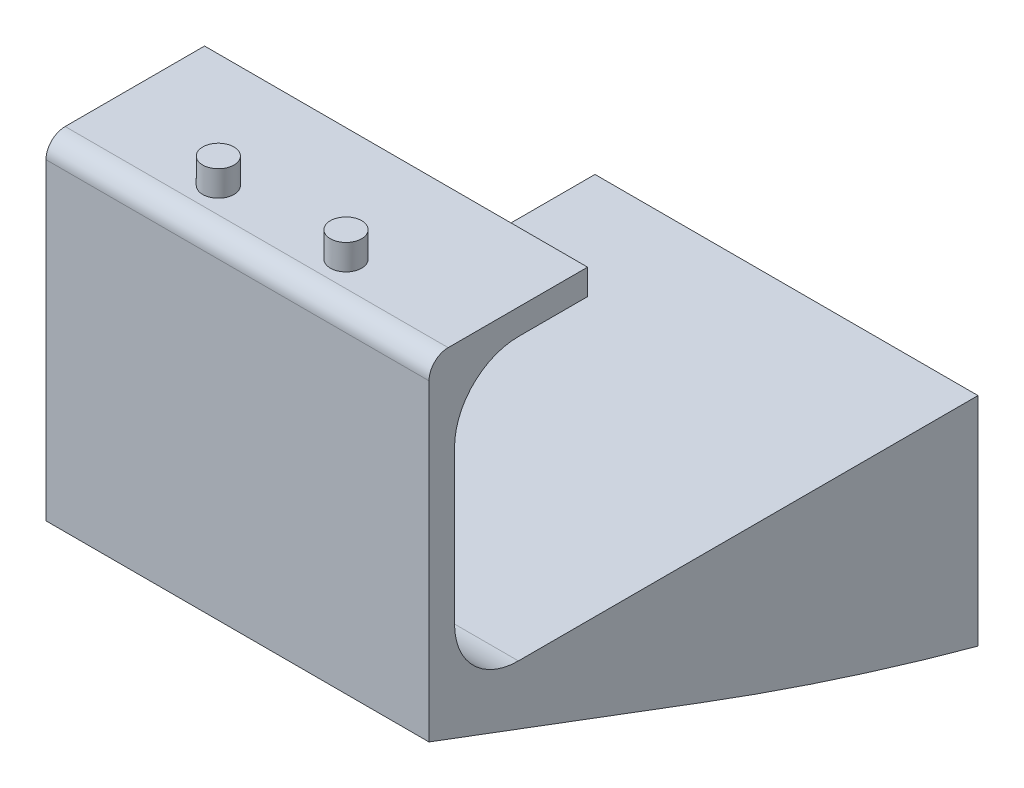
ISO-10303-21;
HEADER;
FILE_DESCRIPTION(('STEP AP214'),'2;1');
FILE_NAME('part.step','',(''),(''),'','','');
FILE_SCHEMA(('AUTOMOTIVE_DESIGN { 1 0 10303 214 1 1 1 1 }'));
ENDSEC;
DATA;
#1=APPLICATION_CONTEXT('core data for automotive mechanical design processes');
#2=APPLICATION_PROTOCOL_DEFINITION('international standard','automotive_design',2000,#1);
#3=PRODUCT_CONTEXT('',#1,'mechanical');
#4=PRODUCT('Part','Part','',(#3));
#5=PRODUCT_RELATED_PRODUCT_CATEGORY('part','',(#4));
#6=PRODUCT_DEFINITION_FORMATION('','',#4);
#7=PRODUCT_DEFINITION_CONTEXT('part definition',#1,'design');
#8=PRODUCT_DEFINITION('design','',#6,#7);
#9=PRODUCT_DEFINITION_SHAPE('','',#8);
#10=(LENGTH_UNIT() NAMED_UNIT(*) SI_UNIT(.MILLI.,.METRE.));
#11=(NAMED_UNIT(*) PLANE_ANGLE_UNIT() SI_UNIT($,.RADIAN.));
#12=(NAMED_UNIT(*) SI_UNIT($,.STERADIAN.) SOLID_ANGLE_UNIT());
#13=UNCERTAINTY_MEASURE_WITH_UNIT(LENGTH_MEASURE(1.E-05),#10,'distance_accuracy_value','');
#14=(GEOMETRIC_REPRESENTATION_CONTEXT(3) GLOBAL_UNCERTAINTY_ASSIGNED_CONTEXT((#13)) GLOBAL_UNIT_ASSIGNED_CONTEXT((#10,
#11,#12)) REPRESENTATION_CONTEXT('',''));
#15=CARTESIAN_POINT('',(0.,0.,0.));
#16=DIRECTION('',(0.,0.,1.));
#17=DIRECTION('',(1.,0.,0.));
#18=AXIS2_PLACEMENT_3D('',#15,#16,#17);
#19=CARTESIAN_POINT('',(-4.88498130835069E-12,-1.22124532708767E-12,43.));
#20=DIRECTION('',(0.,0.,-0.999999999999995));
#21=DIRECTION('',(-0.999999999999995,0.,0.));
#22=AXIS2_PLACEMENT_3D('',#19,#20,#21);
#23=PLANE('',#22);
#24=DIRECTION('',(0.,-1.,0.));
#25=VECTOR('',#24,1.);
#26=CARTESIAN_POINT('',(45.0000006705522,39.000000999999,42.9999999999998));
#27=LINE('',#26,#25);
#28=CARTESIAN_POINT('',(45.0000006705522,39.500000999999,42.9999999999998));
#29=VERTEX_POINT('',#28);
#30=CARTESIAN_POINT('',(44.9999999999999,14.9999999999988,42.9999999999976));
#31=VERTEX_POINT('',#30);
#32=EDGE_CURVE('E255',#29,#31,#27,.T.);
#33=ORIENTED_EDGE('',*,*,#32,.F.);
#34=DIRECTION('',(0.999999999999995,0.,0.));
#35=VECTOR('',#34,1.);
#36=CARTESIAN_POINT('',(0.,39.500000999999,43.));
#37=LINE('',#36,#35);
#38=CARTESIAN_POINT('',(14.9999999999999,39.500000999999,43.));
#39=VERTEX_POINT('',#38);
#40=EDGE_CURVE('E317',#29,#39,#37,.F.);
#41=ORIENTED_EDGE('',*,*,#40,.T.);
#42=DIRECTION('',(0.,1.,0.));
#43=VECTOR('',#42,1.);
#44=CARTESIAN_POINT('',(14.9999999999999,39.0000009999988,43.));
#45=LINE('',#44,#43);
#46=CARTESIAN_POINT('',(14.9999999999999,14.9999999999987,43.));
#47=VERTEX_POINT('',#46);
#48=EDGE_CURVE('E226',#47,#39,#45,.T.);
#49=ORIENTED_EDGE('',*,*,#48,.F.);
#50=DIRECTION('',(0.999999999999995,0.,0.));
#51=VECTOR('',#50,1.);
#52=CARTESIAN_POINT('',(14.9999999999999,14.9999999999987,43.));
#53=LINE('',#52,#51);
#54=CARTESIAN_POINT('',(18.,14.9999999999976,43.));
#55=VERTEX_POINT('',#54);
#56=EDGE_CURVE('E230',#47,#55,#53,.T.);
#57=ORIENTED_EDGE('',*,*,#56,.T.);
#58=DIRECTION('',(-0.999999999999995,0.,0.));
#59=VECTOR('',#58,1.);
#60=CARTESIAN_POINT('',(42.0000006705523,14.999999999999,42.9999999999975));
#61=LINE('',#60,#59);
#62=CARTESIAN_POINT('',(42.0000006705523,14.999999999999,42.9999999999975));
#63=VERTEX_POINT('',#62);
#64=EDGE_CURVE('E260',#63,#55,#61,.T.);
#65=ORIENTED_EDGE('',*,*,#64,.F.);
#66=DIRECTION('',(-0.999999999999995,0.,0.));
#67=VECTOR('',#66,1.);
#68=CARTESIAN_POINT('',(44.9999999999999,14.9999999999988,42.9999999999976));
#69=LINE('',#68,#67);
#70=EDGE_CURVE('E283',#31,#63,#69,.T.);
#71=ORIENTED_EDGE('',*,*,#70,.F.);
#72=EDGE_LOOP('',(#33,#41,#49,#57,#65,#71));
#73=FACE_BOUND('',#72,.T.);
#74=ADVANCED_FACE('F40',(#73),#23,.F.);
#75=CARTESIAN_POINT('',(42.0000003352761,236.859239142874,-64.5596687774861));
#76=DIRECTION('',(-0.999999999999995,0.,0.));
#77=DIRECTION('',(0.,0.,0.999999999999995));
#78=AXIS2_PLACEMENT_3D('',#75,#76,#77);
#79=CYLINDRICAL_SURFACE('',#78,245.5);
#80=DIRECTION('',(-0.999999999999995,0.,0.));
#81=VECTOR('',#80,1.);
#82=CARTESIAN_POINT('',(42.0000003352761,0.838178314233939,3.));
#83=LINE('',#82,#81);
#84=CARTESIAN_POINT('',(42.0000006705523,0.838178314233939,3.));
#85=VERTEX_POINT('',#84);
#86=CARTESIAN_POINT('',(18.,0.83817831423233,3.));
#87=VERTEX_POINT('',#86);
#88=EDGE_CURVE('E288',#85,#87,#83,.T.);
#89=ORIENTED_EDGE('',*,*,#88,.T.);
#90=CARTESIAN_POINT('',(18.,236.859239142871,-64.5596687774885));
#91=DIRECTION('',(-0.999999999999995,0.,0.));
#92=DIRECTION('',(0.,0.,-0.999999999999995));
#93=AXIS2_PLACEMENT_3D('',#90,#91,#92);
#94=CIRCLE('',#93,245.5);
#95=CARTESIAN_POINT('',(18.,6.99042604967193,21.6411361324593));
#96=VERTEX_POINT('',#95);
#97=EDGE_CURVE('E215',#87,#96,#94,.T.);
#98=ORIENTED_EDGE('',*,*,#97,.T.);
#99=DIRECTION('',(0.999999999999995,0.,0.));
#100=VECTOR('',#99,1.);
#101=CARTESIAN_POINT('',(14.9999999999999,6.99042604967193,21.6411361324593));
#102=LINE('',#101,#100);
#103=CARTESIAN_POINT('',(14.9999999999999,6.99042604967193,21.6411361324593));
#104=VERTEX_POINT('',#103);
#105=EDGE_CURVE('E239',#104,#96,#102,.T.);
#106=ORIENTED_EDGE('',*,*,#105,.F.);
#107=CARTESIAN_POINT('',(14.9999999999999,236.859239142874,-64.5596687774861));
#108=DIRECTION('',(-0.999999999999995,0.,0.));
#109=DIRECTION('',(0.,0.,-0.999999999999995));
#110=AXIS2_PLACEMENT_3D('',#107,#108,#109);
#111=CIRCLE('',#110,245.5);
#112=CARTESIAN_POINT('',(14.9999999999999,-1.0547118733939E-12,1.11022302462516E-13));
#113=VERTEX_POINT('',#112);
#114=EDGE_CURVE('E219',#113,#104,#111,.T.);
#115=ORIENTED_EDGE('',*,*,#114,.F.);
#116=DIRECTION('',(-0.999999999999995,0.,0.));
#117=VECTOR('',#116,1.);
#118=CARTESIAN_POINT('',(42.0000003352761,4.44089209850063E-13,0.));
#119=LINE('',#118,#117);
#120=CARTESIAN_POINT('',(44.9999999999999,2.22044604925031E-13,0.));
#121=VERTEX_POINT('',#120);
#122=EDGE_CURVE('E284',#121,#113,#119,.T.);
#123=ORIENTED_EDGE('',*,*,#122,.F.);
#124=CARTESIAN_POINT('',(44.9999999999999,236.859239142874,-64.5596687774861));
#125=DIRECTION('',(0.999999999999995,0.,0.));
#126=DIRECTION('',(0.,0.,0.999999999999995));
#127=AXIS2_PLACEMENT_3D('',#124,#125,#126);
#128=CIRCLE('',#127,245.5);
#129=CARTESIAN_POINT('',(44.9999999999999,6.9904260496732,21.6411361324614));
#130=VERTEX_POINT('',#129);
#131=EDGE_CURVE('E267',#130,#121,#128,.T.);
#132=ORIENTED_EDGE('',*,*,#131,.F.);
#133=DIRECTION('',(-0.999999999999995,0.,0.));
#134=VECTOR('',#133,1.);
#135=CARTESIAN_POINT('',(44.9999999999999,6.9904260496732,21.6411361324614));
#136=LINE('',#135,#134);
#137=CARTESIAN_POINT('',(42.0000006705523,6.99042604967359,21.6411361324615));
#138=VERTEX_POINT('',#137);
#139=EDGE_CURVE('E276',#130,#138,#136,.T.);
#140=ORIENTED_EDGE('',*,*,#139,.T.);
#141=CARTESIAN_POINT('',(42.0000003352761,236.859239142874,-64.5596687774861));
#142=DIRECTION('',(0.999999999999995,0.,0.));
#143=DIRECTION('',(0.,0.,0.999999999999995));
#144=AXIS2_PLACEMENT_3D('',#141,#142,#143);
#145=CIRCLE('',#144,245.5);
#146=EDGE_CURVE('E268',#138,#85,#145,.T.);
#147=ORIENTED_EDGE('',*,*,#146,.T.);
#148=EDGE_LOOP('',(#89,#98,#106,#115,#123,#132,#140,#147));
#149=FACE_BOUND('',#148,.T.);
#150=ADVANCED_FACE('F368',(#149),#79,.T.);
#151=CARTESIAN_POINT('',(42.0000003352761,0.838178314235161,8.88178419700125E-13));
#152=DIRECTION('',(0.,0.,-0.999999999999995));
#153=DIRECTION('',(0.,1.,0.));
#154=AXIS2_PLACEMENT_3D('',#151,#152,#153);
#155=PLANE('',#154);
#156=CARTESIAN_POINT('',(36.0000000447005,9.99999999999879,0.));
#157=DIRECTION('',(0.,0.,0.999999999999995));
#158=DIRECTION('',(0.999999999999995,0.,0.));
#159=AXIS2_PLACEMENT_3D('',#156,#157,#158);
#160=CIRCLE('',#159,2.49999999999999);
#161=CARTESIAN_POINT('',(38.5000000447036,9.99999999999879,0.));
#162=VERTEX_POINT('',#161);
#163=EDGE_CURVE('E423',#162,#162,#160,.T.);
#164=ORIENTED_EDGE('',*,*,#163,.T.);
#165=EDGE_LOOP('',(#164));
#166=FACE_BOUND('',#165,.T.);
#167=CARTESIAN_POINT('',(23.9999999552933,10.,0.));
#168=DIRECTION('',(0.,0.,0.999999999999995));
#169=DIRECTION('',(0.999999999999995,0.,0.));
#170=AXIS2_PLACEMENT_3D('',#167,#168,#169);
#171=CIRCLE('',#170,2.49999999999999);
#172=CARTESIAN_POINT('',(26.4999999552964,9.99999999999757,0.));
#173=VERTEX_POINT('',#172);
#174=EDGE_CURVE('E192',#173,#173,#171,.T.);
#175=ORIENTED_EDGE('',*,*,#174,.T.);
#176=EDGE_LOOP('',(#175));
#177=FACE_BOUND('',#176,.T.);
#178=DIRECTION('',(-0.999999999999995,0.,0.));
#179=VECTOR('',#178,1.);
#180=CARTESIAN_POINT('',(45.0000249999969,17.,0.));
#181=LINE('',#180,#179);
#182=CARTESIAN_POINT('',(44.999999999997,17.,0.));
#183=VERTEX_POINT('',#182);
#184=CARTESIAN_POINT('',(14.999999999997,16.9999999999988,-1.55431223447522E-12));
#185=VERTEX_POINT('',#184);
#186=EDGE_CURVE('E205',#183,#185,#181,.T.);
#187=ORIENTED_EDGE('',*,*,#186,.F.);
#188=DIRECTION('',(0.,1.,0.));
#189=VECTOR('',#188,1.);
#190=CARTESIAN_POINT('',(44.9999999999968,15.,-2.44249065417534E-12));
#191=LINE('',#190,#189);
#192=EDGE_CURVE('E272',#121,#183,#191,.T.);
#193=ORIENTED_EDGE('',*,*,#192,.F.);
#194=ORIENTED_EDGE('',*,*,#122,.T.);
#195=DIRECTION('',(0.,-1.,0.));
#196=VECTOR('',#195,1.);
#197=CARTESIAN_POINT('',(14.9999999999999,-9.99200722162641E-13,0.));
#198=LINE('',#197,#196);
#199=EDGE_CURVE('E216',#185,#113,#198,.T.);
#200=ORIENTED_EDGE('',*,*,#199,.F.);
#201=EDGE_LOOP('',(#187,#193,#194,#200));
#202=FACE_BOUND('',#201,.T.);
#203=ADVANCED_FACE('F374',(#166,#177,#202),#155,.T.);
#204=CARTESIAN_POINT('',(44.9999999999999,6.99042604967326,21.6411361324615));
#205=DIRECTION('',(0.,0.936329177569047,-0.351123441588383));
#206=DIRECTION('',(0.,0.351123441588386,0.936329177569042));
#207=AXIS2_PLACEMENT_3D('',#204,#205,#206);
#208=PLANE('',#207);
#209=DIRECTION('',(0.,-0.351123441588386,-0.936329177569042));
#210=VECTOR('',#209,1.);
#211=CARTESIAN_POINT('',(42.0000003352761,6.99042604967326,21.6411361324615));
#212=LINE('',#211,#210);
#213=EDGE_CURVE('E263',#63,#138,#212,.T.);
#214=ORIENTED_EDGE('',*,*,#213,.T.);
#215=ORIENTED_EDGE('',*,*,#139,.F.);
#216=DIRECTION('',(0.,-0.351123441588386,-0.936329177569042));
#217=VECTOR('',#216,1.);
#218=CARTESIAN_POINT('',(44.9999999999999,6.99042604967326,21.6411361324615));
#219=LINE('',#218,#217);
#220=EDGE_CURVE('E264',#31,#130,#219,.T.);
#221=ORIENTED_EDGE('',*,*,#220,.F.);
#222=ORIENTED_EDGE('',*,*,#70,.T.);
#223=EDGE_LOOP('',(#214,#215,#221,#222));
#224=FACE_BOUND('',#223,.T.);
#225=ADVANCED_FACE('F385',(#224),#208,.F.);
#226=CARTESIAN_POINT('',(44.9999999999999,236.859239142874,-64.5596687774861));
#227=DIRECTION('',(-0.999999999999995,0.,0.));
#228=DIRECTION('',(0.,0.,0.999999999999995));
#229=AXIS2_PLACEMENT_3D('',#226,#227,#228);
#230=PLANE('',#229);
#231=DIRECTION('',(0.,0.,-0.999999999999995));
#232=VECTOR('',#231,1.);
#233=CARTESIAN_POINT('',(45.0000006705491,41.000000999999,30.579892407551));
#234=LINE('',#233,#232);
#235=CARTESIAN_POINT('',(45.0000006705522,41.0000010000002,41.5));
#236=VERTEX_POINT('',#235);
#237=CARTESIAN_POINT('',(45.0000006705491,41.000000999999,30.579892407551));
#238=VERTEX_POINT('',#237);
#239=EDGE_CURVE('E156',#236,#238,#234,.T.);
#240=ORIENTED_EDGE('',*,*,#239,.F.);
#241=CARTESIAN_POINT('',(44.9999999999999,39.5000010000002,41.5));
#242=DIRECTION('',(-0.999999999999995,0.,0.));
#243=DIRECTION('',(0.,0.,0.999999999999995));
#244=AXIS2_PLACEMENT_3D('',#241,#242,#243);
#245=CIRCLE('',#244,1.5);
#246=EDGE_CURVE('E314',#236,#29,#245,.F.);
#247=ORIENTED_EDGE('',*,*,#246,.T.);
#248=ORIENTED_EDGE('',*,*,#32,.T.);
#249=ORIENTED_EDGE('',*,*,#220,.T.);
#250=ORIENTED_EDGE('',*,*,#131,.T.);
#251=ORIENTED_EDGE('',*,*,#192,.T.);
#252=DIRECTION('',(0.,0.,0.999999999999995));
#253=VECTOR('',#252,1.);
#254=CARTESIAN_POINT('',(44.9999999999999,17.,-64.5596687774885));
#255=LINE('',#254,#253);
#256=CARTESIAN_POINT('',(44.9999999999982,17.,35.9999999999999));
#257=VERTEX_POINT('',#256);
#258=EDGE_CURVE('E208',#183,#257,#255,.T.);
#259=ORIENTED_EDGE('',*,*,#258,.T.);
#260=CARTESIAN_POINT('',(44.9999999999999,22.,35.9999999999976));
#261=DIRECTION('',(-0.999999999999995,0.,0.));
#262=DIRECTION('',(0.,0.,0.999999999999995));
#263=AXIS2_PLACEMENT_3D('',#260,#261,#262);
#264=CIRCLE('',#263,5.);
#265=CARTESIAN_POINT('',(44.9999999999982,22.,40.9999999999976));
#266=VERTEX_POINT('',#265);
#267=EDGE_CURVE('E339',#257,#266,#264,.T.);
#268=ORIENTED_EDGE('',*,*,#267,.T.);
#269=DIRECTION('',(0.,1.,0.));
#270=VECTOR('',#269,1.);
#271=CARTESIAN_POINT('',(44.999999999997,236.859239142874,41.));
#272=LINE('',#271,#270);
#273=CARTESIAN_POINT('',(44.9999999999999,34.0000010000002,40.9999999999999));
#274=VERTEX_POINT('',#273);
#275=EDGE_CURVE('E212',#266,#274,#272,.T.);
#276=ORIENTED_EDGE('',*,*,#275,.T.);
#277=CARTESIAN_POINT('',(44.9999999999999,34.0000010000002,35.9999999999999));
#278=DIRECTION('',(-0.999999999999995,0.,0.));
#279=DIRECTION('',(0.,0.,0.999999999999995));
#280=AXIS2_PLACEMENT_3D('',#277,#278,#279);
#281=CIRCLE('',#280,5.);
#282=CARTESIAN_POINT('',(45.0000006705522,39.0000010000002,35.9999999999999));
#283=VERTEX_POINT('',#282);
#284=EDGE_CURVE('E64',#274,#283,#281,.T.);
#285=ORIENTED_EDGE('',*,*,#284,.T.);
#286=DIRECTION('',(0.,0.,-0.999999999999995));
#287=VECTOR('',#286,1.);
#288=CARTESIAN_POINT('',(45.0000006705522,39.000000999999,30.579892407551));
#289=LINE('',#288,#287);
#290=CARTESIAN_POINT('',(45.0000006705522,39.000000999999,30.579892407551));
#291=VERTEX_POINT('',#290);
#292=EDGE_CURVE('E171',#283,#291,#289,.T.);
#293=ORIENTED_EDGE('',*,*,#292,.T.);
#294=DIRECTION('',(0.,-1.,0.));
#295=VECTOR('',#294,1.);
#296=CARTESIAN_POINT('',(45.0000006705491,41.000000999999,30.579892407551));
#297=LINE('',#296,#295);
#298=EDGE_CURVE('E169',#238,#291,#297,.T.);
#299=ORIENTED_EDGE('',*,*,#298,.F.);
#300=EDGE_LOOP('',(#240,#247,#248,#249,#250,#251,#259,#268,#276,#285,#293,#299));
#301=FACE_BOUND('',#300,.T.);
#302=ADVANCED_FACE('F170',(#301),#230,.F.);
#303=CARTESIAN_POINT('',(42.0000006705523,6.99042604967359,21.6411361324627));
#304=DIRECTION('',(0.999999999999995,0.,0.));
#305=DIRECTION('',(0.,0.,-0.999999999999995));
#306=AXIS2_PLACEMENT_3D('',#303,#304,#305);
#307=PLANE('',#306);
#308=ORIENTED_EDGE('',*,*,#146,.F.);
#309=ORIENTED_EDGE('',*,*,#213,.F.);
#310=DIRECTION('',(0.,0.,0.999999999999995));
#311=VECTOR('',#310,1.);
#312=CARTESIAN_POINT('',(42.0000006705492,14.9999999999976,2.99999999999756));
#313=LINE('',#312,#311);
#314=CARTESIAN_POINT('',(42.0000006705492,14.9999999999976,2.99999999999756));
#315=VERTEX_POINT('',#314);
#316=EDGE_CURVE('E251',#315,#63,#313,.T.);
#317=ORIENTED_EDGE('',*,*,#316,.F.);
#318=DIRECTION('',(0.,-1.,0.));
#319=VECTOR('',#318,1.);
#320=CARTESIAN_POINT('',(42.0000006705523,6.99042604967115,2.99999999999989));
#321=LINE('',#320,#319);
#322=EDGE_CURVE('E252',#315,#85,#321,.T.);
#323=ORIENTED_EDGE('',*,*,#322,.T.);
#324=EDGE_LOOP('',(#308,#309,#317,#323));
#325=FACE_BOUND('',#324,.T.);
#326=ADVANCED_FACE('F384',(#325),#307,.F.);
#327=CARTESIAN_POINT('',(18.,6.99042604967104,2.99999999999989));
#328=DIRECTION('',(0.,0.,-0.999999999999995));
#329=DIRECTION('',(0.,1.,0.));
#330=AXIS2_PLACEMENT_3D('',#327,#328,#329);
#331=PLANE('',#330);
#332=CARTESIAN_POINT('',(36.0000000447036,9.99999999999879,3.));
#333=DIRECTION('',(0.,0.,0.999999999999995));
#334=DIRECTION('',(0.999999999999995,0.,0.));
#335=AXIS2_PLACEMENT_3D('',#332,#333,#334);
#336=CIRCLE('',#335,2.49999999999999);
#337=CARTESIAN_POINT('',(38.5000000447036,9.99999999999879,3.));
#338=VERTEX_POINT('',#337);
#339=EDGE_CURVE('E427',#338,#338,#336,.T.);
#340=ORIENTED_EDGE('',*,*,#339,.F.);
#341=EDGE_LOOP('',(#340));
#342=FACE_BOUND('',#341,.T.);
#343=CARTESIAN_POINT('',(23.9999999552964,9.99999999999757,3.));
#344=DIRECTION('',(0.,0.,0.999999999999995));
#345=DIRECTION('',(0.999999999999995,0.,0.));
#346=AXIS2_PLACEMENT_3D('',#343,#344,#345);
#347=CIRCLE('',#346,2.49999999999999);
#348=CARTESIAN_POINT('',(26.4999999552964,9.99999999999757,3.));
#349=VERTEX_POINT('',#348);
#350=EDGE_CURVE('E419',#349,#349,#347,.T.);
#351=ORIENTED_EDGE('',*,*,#350,.F.);
#352=EDGE_LOOP('',(#351));
#353=FACE_BOUND('',#352,.T.);
#354=ORIENTED_EDGE('',*,*,#88,.F.);
#355=ORIENTED_EDGE('',*,*,#322,.F.);
#356=DIRECTION('',(0.999999999999995,0.,0.));
#357=VECTOR('',#356,1.);
#358=CARTESIAN_POINT('',(17.9999999999969,14.9999999999976,2.99999999999745));
#359=LINE('',#358,#357);
#360=CARTESIAN_POINT('',(17.9999999999969,14.9999999999976,2.99999999999745));
#361=VERTEX_POINT('',#360);
#362=EDGE_CURVE('E247',#361,#315,#359,.T.);
#363=ORIENTED_EDGE('',*,*,#362,.F.);
#364=DIRECTION('',(0.,-1.,0.));
#365=VECTOR('',#364,1.);
#366=CARTESIAN_POINT('',(18.,6.99042604967104,2.99999999999989));
#367=LINE('',#366,#365);
#368=EDGE_CURVE('E256',#361,#87,#367,.T.);
#369=ORIENTED_EDGE('',*,*,#368,.T.);
#370=EDGE_LOOP('',(#354,#355,#363,#369));
#371=FACE_BOUND('',#370,.T.);
#372=ADVANCED_FACE('F380',(#342,#353,#371),#331,.F.);
#373=CARTESIAN_POINT('',(-3.10862446895044E-12,15.,-2.55351295663786E-12));
#374=DIRECTION('',(0.,-1.,0.));
#375=DIRECTION('',(0.,0.,-0.999999999999995));
#376=AXIS2_PLACEMENT_3D('',#373,#374,#375);
#377=PLANE('',#376);
#378=DIRECTION('',(0.,0.,-0.999999999999995));
#379=VECTOR('',#378,1.);
#380=CARTESIAN_POINT('',(18.,14.9999999999978,43.));
#381=LINE('',#380,#379);
#382=EDGE_CURVE('E243',#55,#361,#381,.T.);
#383=ORIENTED_EDGE('',*,*,#382,.T.);
#384=ORIENTED_EDGE('',*,*,#362,.T.);
#385=ORIENTED_EDGE('',*,*,#316,.T.);
#386=ORIENTED_EDGE('',*,*,#64,.T.);
#387=EDGE_LOOP('',(#383,#384,#385,#386));
#388=FACE_BOUND('',#387,.T.);
#389=ADVANCED_FACE('F471',(#388),#377,.T.);
#390=CARTESIAN_POINT('',(18.,236.859239142871,-64.5596687774885));
#391=DIRECTION('',(0.999999999999995,0.,0.));
#392=DIRECTION('',(0.,0.,-0.999999999999995));
#393=AXIS2_PLACEMENT_3D('',#390,#391,#392);
#394=PLANE('',#393);
#395=ORIENTED_EDGE('',*,*,#368,.F.);
#396=ORIENTED_EDGE('',*,*,#382,.F.);
#397=DIRECTION('',(0.,0.351123441588391,0.93632917756904));
#398=VECTOR('',#397,1.);
#399=CARTESIAN_POINT('',(18.,14.9999999999976,43.));
#400=LINE('',#399,#398);
#401=EDGE_CURVE('E220',#96,#55,#400,.T.);
#402=ORIENTED_EDGE('',*,*,#401,.F.);
#403=ORIENTED_EDGE('',*,*,#97,.F.);
#404=EDGE_LOOP('',(#395,#396,#402,#403));
#405=FACE_BOUND('',#404,.T.);
#406=ADVANCED_FACE('F488',(#405),#394,.T.);
#407=CARTESIAN_POINT('',(14.9999999999999,14.9999999999987,43.));
#408=DIRECTION('',(0.,0.936329177569045,-0.351123441588388));
#409=DIRECTION('',(0.,0.351123441588391,0.93632917756904));
#410=AXIS2_PLACEMENT_3D('',#407,#408,#409);
#411=PLANE('',#410);
#412=ORIENTED_EDGE('',*,*,#401,.T.);
#413=ORIENTED_EDGE('',*,*,#56,.F.);
#414=DIRECTION('',(0.,0.351123441588391,0.93632917756904));
#415=VECTOR('',#414,1.);
#416=CARTESIAN_POINT('',(14.9999999999999,14.9999999999987,43.));
#417=LINE('',#416,#415);
#418=EDGE_CURVE('E223',#104,#47,#417,.T.);
#419=ORIENTED_EDGE('',*,*,#418,.F.);
#420=ORIENTED_EDGE('',*,*,#105,.T.);
#421=EDGE_LOOP('',(#412,#413,#419,#420));
#422=FACE_BOUND('',#421,.T.);
#423=ADVANCED_FACE('F490',(#422),#411,.F.);
#424=CARTESIAN_POINT('',(14.9999999999999,236.859239142874,-64.5596687774861));
#425=DIRECTION('',(0.999999999999995,0.,0.));
#426=DIRECTION('',(0.,0.,-0.999999999999995));
#427=AXIS2_PLACEMENT_3D('',#424,#425,#426);
#428=PLANE('',#427);
#429=ORIENTED_EDGE('',*,*,#48,.T.);
#430=CARTESIAN_POINT('',(14.9999999999999,39.5000010000001,41.5));
#431=DIRECTION('',(0.999999999999995,0.,0.));
#432=DIRECTION('',(0.,0.,-0.999999999999995));
#433=AXIS2_PLACEMENT_3D('',#430,#431,#432);
#434=CIRCLE('',#433,1.5);
#435=CARTESIAN_POINT('',(14.9999999999999,41.0000010000001,41.5));
#436=VERTEX_POINT('',#435);
#437=EDGE_CURVE('E320',#39,#436,#434,.F.);
#438=ORIENTED_EDGE('',*,*,#437,.T.);
#439=DIRECTION('',(0.,0.,0.999999999999995));
#440=VECTOR('',#439,1.);
#441=CARTESIAN_POINT('',(14.9999999999999,41.000000999999,43.));
#442=LINE('',#441,#440);
#443=CARTESIAN_POINT('',(14.999999999997,41.0000009999989,30.579892407551));
#444=VERTEX_POINT('',#443);
#445=EDGE_CURVE('E166',#444,#436,#442,.T.);
#446=ORIENTED_EDGE('',*,*,#445,.F.);
#447=DIRECTION('',(0.,-1.,0.));
#448=VECTOR('',#447,1.);
#449=CARTESIAN_POINT('',(14.999999999997,41.0000009999989,30.579892407551));
#450=LINE('',#449,#448);
#451=CARTESIAN_POINT('',(15.0000000000001,39.0000009999989,30.579892407551));
#452=VERTEX_POINT('',#451);
#453=EDGE_CURVE('E176',#444,#452,#450,.T.);
#454=ORIENTED_EDGE('',*,*,#453,.T.);
#455=DIRECTION('',(0.,0.,0.999999999999995));
#456=VECTOR('',#455,1.);
#457=CARTESIAN_POINT('',(14.9999999999999,39.000000999999,43.));
#458=LINE('',#457,#456);
#459=CARTESIAN_POINT('',(14.9999999999999,39.000000999999,35.9999999999999));
#460=VERTEX_POINT('',#459);
#461=EDGE_CURVE('E188',#452,#460,#458,.T.);
#462=ORIENTED_EDGE('',*,*,#461,.T.);
#463=CARTESIAN_POINT('',(14.9999999999999,34.0000009999989,35.9999999999999));
#464=DIRECTION('',(0.999999999999995,0.,0.));
#465=DIRECTION('',(0.,0.,-0.999999999999995));
#466=AXIS2_PLACEMENT_3D('',#463,#464,#465);
#467=CIRCLE('',#466,5.);
#468=CARTESIAN_POINT('',(14.9999999999999,34.0000009999989,40.9999999999998));
#469=VERTEX_POINT('',#468);
#470=EDGE_CURVE('E56',#460,#469,#467,.T.);
#471=ORIENTED_EDGE('',*,*,#470,.T.);
#472=DIRECTION('',(0.,1.,0.));
#473=VECTOR('',#472,1.);
#474=CARTESIAN_POINT('',(14.9999999999981,16.9999999999988,40.9999999999985));
#475=LINE('',#474,#473);
#476=CARTESIAN_POINT('',(14.9999999999981,21.9999999999988,40.9999999999968));
#477=VERTEX_POINT('',#476);
#478=EDGE_CURVE('E201',#477,#469,#475,.T.);
#479=ORIENTED_EDGE('',*,*,#478,.F.);
#480=CARTESIAN_POINT('',(14.9999999999999,21.9999999999988,35.9999999999967));
#481=DIRECTION('',(0.999999999999995,0.,0.));
#482=DIRECTION('',(0.,0.,-0.999999999999995));
#483=AXIS2_PLACEMENT_3D('',#480,#481,#482);
#484=CIRCLE('',#483,5.);
#485=CARTESIAN_POINT('',(14.9999999999981,16.9999999999988,35.9999999999984));
#486=VERTEX_POINT('',#485);
#487=EDGE_CURVE('E336',#477,#486,#484,.T.);
#488=ORIENTED_EDGE('',*,*,#487,.T.);
#489=DIRECTION('',(0.,0.,0.999999999999995));
#490=VECTOR('',#489,1.);
#491=CARTESIAN_POINT('',(14.999999999997,16.9999999999988,-1.55431223447522E-12));
#492=LINE('',#491,#490);
#493=EDGE_CURVE('E175',#185,#486,#492,.T.);
#494=ORIENTED_EDGE('',*,*,#493,.F.);
#495=ORIENTED_EDGE('',*,*,#199,.T.);
#496=ORIENTED_EDGE('',*,*,#114,.T.);
#497=ORIENTED_EDGE('',*,*,#418,.T.);
#498=EDGE_LOOP('',(#429,#438,#446,#454,#462,#471,#479,#488,#494,#495,#496,#497));
#499=FACE_BOUND('',#498,.T.);
#500=ADVANCED_FACE('F411',(#499),#428,.F.);
#501=CARTESIAN_POINT('',(45.0000249999982,17.,40.9999999999999));
#502=DIRECTION('',(0.,0.,0.999999999999995));
#503=DIRECTION('',(0.999999999999995,0.,0.));
#504=AXIS2_PLACEMENT_3D('',#501,#502,#503);
#505=PLANE('',#504);
#506=ORIENTED_EDGE('',*,*,#275,.F.);
#507=DIRECTION('',(-0.999999999999995,0.,0.));
#508=VECTOR('',#507,1.);
#509=CARTESIAN_POINT('',(14.9999999999981,21.9999999999988,40.9999999999968));
#510=LINE('',#509,#508);
#511=EDGE_CURVE('E326',#266,#477,#510,.T.);
#512=ORIENTED_EDGE('',*,*,#511,.T.);
#513=ORIENTED_EDGE('',*,*,#478,.T.);
#514=DIRECTION('',(-0.999999999999995,0.,0.));
#515=VECTOR('',#514,1.);
#516=CARTESIAN_POINT('',(45.000025,34.0000010000002,40.9999999999999));
#517=LINE('',#516,#515);
#518=EDGE_CURVE('E323',#469,#274,#517,.F.);
#519=ORIENTED_EDGE('',*,*,#518,.T.);
#520=EDGE_LOOP('',(#506,#512,#513,#519));
#521=FACE_BOUND('',#520,.T.);
#522=ADVANCED_FACE('F407',(#521),#505,.F.);
#523=CARTESIAN_POINT('',(45.0000249999969,17.,0.));
#524=DIRECTION('',(0.,-1.,0.));
#525=DIRECTION('',(0.,0.,-0.999999999999995));
#526=AXIS2_PLACEMENT_3D('',#523,#524,#525);
#527=PLANE('',#526);
#528=ORIENTED_EDGE('',*,*,#493,.T.);
#529=DIRECTION('',(-0.999999999999995,0.,0.));
#530=VECTOR('',#529,1.);
#531=CARTESIAN_POINT('',(44.9999999999982,17.,35.9999999999999));
#532=LINE('',#531,#530);
#533=EDGE_CURVE('E330',#486,#257,#532,.F.);
#534=ORIENTED_EDGE('',*,*,#533,.T.);
#535=ORIENTED_EDGE('',*,*,#258,.F.);
#536=ORIENTED_EDGE('',*,*,#186,.T.);
#537=EDGE_LOOP('',(#528,#534,#535,#536));
#538=FACE_BOUND('',#537,.T.);
#539=ADVANCED_FACE('F363',(#538),#527,.F.);
#540=CARTESIAN_POINT('',(14.999999999997,41.0000009999989,30.579892407551));
#541=DIRECTION('',(0.,0.,0.999999999999995));
#542=DIRECTION('',(0.,-1.,0.));
#543=AXIS2_PLACEMENT_3D('',#540,#541,#542);
#544=PLANE('',#543);
#545=DIRECTION('',(-0.999999999999995,0.,0.));
#546=VECTOR('',#545,1.);
#547=CARTESIAN_POINT('',(15.0000000000001,39.0000009999989,30.579892407551));
#548=LINE('',#547,#546);
#549=EDGE_CURVE('E195',#291,#452,#548,.T.);
#550=ORIENTED_EDGE('',*,*,#549,.T.);
#551=ORIENTED_EDGE('',*,*,#453,.F.);
#552=DIRECTION('',(-0.999999999999995,0.,0.));
#553=VECTOR('',#552,1.);
#554=CARTESIAN_POINT('',(14.999999999997,41.0000009999989,30.579892407551));
#555=LINE('',#554,#553);
#556=EDGE_CURVE('E161',#238,#444,#555,.T.);
#557=ORIENTED_EDGE('',*,*,#556,.F.);
#558=ORIENTED_EDGE('',*,*,#298,.T.);
#559=EDGE_LOOP('',(#550,#551,#557,#558));
#560=FACE_BOUND('',#559,.T.);
#561=ADVANCED_FACE('F178',(#560),#544,.F.);
#562=CARTESIAN_POINT('',(0.,41.000001,6.66133814775094E-13));
#563=DIRECTION('',(0.,-1.,0.));
#564=DIRECTION('',(0.,0.,-0.999999999999995));
#565=AXIS2_PLACEMENT_3D('',#562,#563,#564);
#566=PLANE('',#565);
#567=CARTESIAN_POINT('',(34.9999999999999,41.0000009999979,39.5));
#568=DIRECTION('',(0.,-1.,0.));
#569=DIRECTION('',(0.,0.,-0.999999999999995));
#570=AXIS2_PLACEMENT_3D('',#567,#568,#569);
#571=CIRCLE('',#570,1.225);
#572=CARTESIAN_POINT('',(34.9999999999999,41.0000009999979,38.275));
#573=VERTEX_POINT('',#572);
#574=EDGE_CURVE('E11',#573,#573,#571,.F.);
#575=ORIENTED_EDGE('',*,*,#574,.F.);
#576=EDGE_LOOP('',(#575));
#577=FACE_BOUND('',#576,.T.);
#578=CARTESIAN_POINT('',(24.9999999999999,41.000000999999,39.5));
#579=DIRECTION('',(0.,-1.,0.));
#580=DIRECTION('',(0.,0.,-0.999999999999995));
#581=AXIS2_PLACEMENT_3D('',#578,#579,#580);
#582=CIRCLE('',#581,1.22499999999999);
#583=CARTESIAN_POINT('',(24.9999999999999,41.0000009999989,38.275));
#584=VERTEX_POINT('',#583);
#585=EDGE_CURVE('E49',#584,#584,#582,.F.);
#586=ORIENTED_EDGE('',*,*,#585,.F.);
#587=EDGE_LOOP('',(#586));
#588=FACE_BOUND('',#587,.T.);
#589=ORIENTED_EDGE('',*,*,#445,.T.);
#590=DIRECTION('',(0.999999999999995,0.,0.));
#591=VECTOR('',#590,1.);
#592=CARTESIAN_POINT('',(0.,41.0000010000002,41.5));
#593=LINE('',#592,#591);
#594=EDGE_CURVE('E164',#436,#236,#593,.T.);
#595=ORIENTED_EDGE('',*,*,#594,.T.);
#596=ORIENTED_EDGE('',*,*,#239,.T.);
#597=ORIENTED_EDGE('',*,*,#556,.T.);
#598=EDGE_LOOP('',(#589,#595,#596,#597));
#599=FACE_BOUND('',#598,.T.);
#600=ADVANCED_FACE('F159',(#577,#588,#599),#566,.F.);
#601=CARTESIAN_POINT('',(-4.88498130835069E-12,39.000001,6.66133814775094E-13));
#602=DIRECTION('',(0.,-1.,0.));
#603=DIRECTION('',(0.,0.,-0.999999999999995));
#604=AXIS2_PLACEMENT_3D('',#601,#602,#603);
#605=PLANE('',#604);
#606=ORIENTED_EDGE('',*,*,#292,.F.);
#607=DIRECTION('',(-0.999999999999995,0.,0.));
#608=VECTOR('',#607,1.);
#609=CARTESIAN_POINT('',(0.,39.0000010000002,35.9999999999999));
#610=LINE('',#609,#608);
#611=EDGE_CURVE('E333',#283,#460,#610,.T.);
#612=ORIENTED_EDGE('',*,*,#611,.T.);
#613=ORIENTED_EDGE('',*,*,#461,.F.);
#614=ORIENTED_EDGE('',*,*,#549,.F.);
#615=EDGE_LOOP('',(#606,#612,#613,#614));
#616=FACE_BOUND('',#615,.T.);
#617=ADVANCED_FACE('F353',(#616),#605,.T.);
#618=CARTESIAN_POINT('',(23.9999999552964,9.99999999999757,3.));
#619=DIRECTION('',(0.,0.,0.999999999999995));
#620=DIRECTION('',(0.999999999999995,0.,0.));
#621=AXIS2_PLACEMENT_3D('',#618,#619,#620);
#622=CYLINDRICAL_SURFACE('',#621,2.49999999999999);
#623=CARTESIAN_POINT('',(26.4999999552964,9.99999999999757,0.));
#624=CARTESIAN_POINT('',(26.4999999552964,9.99999999999757,0.03125));
#625=CARTESIAN_POINT('',(26.4999999552964,9.99999999999757,0.0625000000000001));
#626=CARTESIAN_POINT('',(26.4999999552964,9.99999999999757,0.125));
#627=CARTESIAN_POINT('',(26.4999999552964,9.99999999999757,0.15625));
#628=CARTESIAN_POINT('',(26.4999999552964,9.99999999999757,0.21875));
#629=CARTESIAN_POINT('',(26.4999999552964,9.99999999999757,0.25));
#630=CARTESIAN_POINT('',(26.4999999552964,9.99999999999757,0.3125));
#631=CARTESIAN_POINT('',(26.4999999552964,9.99999999999757,0.34375));
#632=CARTESIAN_POINT('',(26.4999999552964,9.99999999999757,0.40625));
#633=CARTESIAN_POINT('',(26.4999999552964,9.99999999999757,0.4375));
#634=CARTESIAN_POINT('',(26.4999999552964,9.99999999999757,0.5));
#635=CARTESIAN_POINT('',(26.4999999552964,9.99999999999757,0.53125));
#636=CARTESIAN_POINT('',(26.4999999552964,9.99999999999757,0.59375));
#637=CARTESIAN_POINT('',(26.4999999552964,9.99999999999757,0.625));
#638=CARTESIAN_POINT('',(26.4999999552964,9.99999999999757,0.6875));
#639=CARTESIAN_POINT('',(26.4999999552964,9.99999999999757,0.71875));
#640=CARTESIAN_POINT('',(26.4999999552964,9.99999999999757,0.78125));
#641=CARTESIAN_POINT('',(26.4999999552964,9.99999999999757,0.8125));
#642=CARTESIAN_POINT('',(26.4999999552964,9.99999999999757,0.875));
#643=CARTESIAN_POINT('',(26.4999999552964,9.99999999999757,0.90625));
#644=CARTESIAN_POINT('',(26.4999999552964,9.99999999999757,0.968750000000001));
#645=CARTESIAN_POINT('',(26.4999999552964,9.99999999999757,1.));
#646=CARTESIAN_POINT('',(26.4999999552964,9.99999999999757,1.0625));
#647=CARTESIAN_POINT('',(26.4999999552964,9.99999999999757,1.09375));
#648=CARTESIAN_POINT('',(26.4999999552964,9.99999999999757,1.15625));
#649=CARTESIAN_POINT('',(26.4999999552964,9.99999999999757,1.1875));
#650=CARTESIAN_POINT('',(26.4999999552964,9.99999999999757,1.25));
#651=CARTESIAN_POINT('',(26.4999999552964,9.99999999999757,1.28125));
#652=CARTESIAN_POINT('',(26.4999999552964,9.99999999999757,1.34375));
#653=CARTESIAN_POINT('',(26.4999999552964,9.99999999999757,1.375));
#654=CARTESIAN_POINT('',(26.4999999552964,9.99999999999757,1.4375));
#655=CARTESIAN_POINT('',(26.4999999552964,9.99999999999757,1.46875));
#656=CARTESIAN_POINT('',(26.4999999552964,9.99999999999757,1.53125));
#657=CARTESIAN_POINT('',(26.4999999552964,9.99999999999757,1.5625));
#658=CARTESIAN_POINT('',(26.4999999552964,9.99999999999757,1.625));
#659=CARTESIAN_POINT('',(26.4999999552964,9.99999999999757,1.65625));
#660=CARTESIAN_POINT('',(26.4999999552964,9.99999999999757,1.71875));
#661=CARTESIAN_POINT('',(26.4999999552964,9.99999999999757,1.75));
#662=CARTESIAN_POINT('',(26.4999999552964,9.99999999999757,1.8125));
#663=CARTESIAN_POINT('',(26.4999999552964,9.99999999999757,1.84375));
#664=CARTESIAN_POINT('',(26.4999999552964,9.99999999999757,1.90625));
#665=CARTESIAN_POINT('',(26.4999999552964,9.99999999999757,1.9375));
#666=CARTESIAN_POINT('',(26.4999999552964,9.99999999999757,2.));
#667=CARTESIAN_POINT('',(26.4999999552964,9.99999999999757,2.03125));
#668=CARTESIAN_POINT('',(26.4999999552964,9.99999999999757,2.09375));
#669=CARTESIAN_POINT('',(26.4999999552964,9.99999999999757,2.125));
#670=CARTESIAN_POINT('',(26.4999999552964,9.99999999999757,2.1875));
#671=CARTESIAN_POINT('',(26.4999999552964,9.99999999999757,2.21875));
#672=CARTESIAN_POINT('',(26.4999999552964,9.99999999999757,2.28125));
#673=CARTESIAN_POINT('',(26.4999999552964,9.99999999999757,2.3125));
#674=CARTESIAN_POINT('',(26.4999999552964,9.99999999999757,2.375));
#675=CARTESIAN_POINT('',(26.4999999552964,9.99999999999757,2.40625));
#676=CARTESIAN_POINT('',(26.4999999552964,9.99999999999757,2.46875));
#677=CARTESIAN_POINT('',(26.4999999552964,9.99999999999757,2.5));
#678=CARTESIAN_POINT('',(26.4999999552964,9.99999999999757,2.5625));
#679=CARTESIAN_POINT('',(26.4999999552964,9.99999999999757,2.59375));
#680=CARTESIAN_POINT('',(26.4999999552964,9.99999999999757,2.65625));
#681=CARTESIAN_POINT('',(26.4999999552964,9.99999999999757,2.6875));
#682=CARTESIAN_POINT('',(26.4999999552964,9.99999999999757,2.75));
#683=CARTESIAN_POINT('',(26.4999999552964,9.99999999999757,2.78125));
#684=CARTESIAN_POINT('',(26.4999999552964,9.99999999999757,2.84375));
#685=CARTESIAN_POINT('',(26.4999999552964,9.99999999999757,2.875));
#686=CARTESIAN_POINT('',(26.4999999552964,9.99999999999757,2.9375));
#687=CARTESIAN_POINT('',(26.4999999552964,9.99999999999757,2.96875));
#688=CARTESIAN_POINT('',(26.4999999552964,9.99999999999757,3.));
#689=B_SPLINE_CURVE_WITH_KNOTS('',3,(#623,#624,#625,#626,#627,#628,#629,#630,#631,#632,#633,
#634,#635,#636,#637,#638,#639,#640,#641,#642,#643,#644,#645,#646,#647,#648,#649,#650,#651,#652,
#653,#654,#655,#656,#657,#658,#659,#660,#661,#662,#663,#664,#665,#666,#667,#668,#669,#670,#671,
#672,#673,#674,#675,#676,#677,#678,#679,#680,#681,#682,#683,#684,#685,#686,#687,#688),
.UNSPECIFIED.,.F.,.F.,(4,2,2,2,2,2,2,2,2,2,2,2,2,2,2,2,2,2,2,2,2,2,2,2,2,2,2,2,2,2,2,2,4),(0.,
0.0937500000000001,0.1875,0.28125,0.375,0.46875,0.5625,0.65625,0.75,0.84375,0.9375,1.03125,
1.125,1.21875,1.3125,1.40625,1.5,1.59375,1.6875,1.78125,1.875,1.96875,2.0625,2.15625,2.25,
2.34375,2.4375,2.53125,2.625,2.71875,2.8125,2.90625,3.),.UNSPECIFIED.);
#690=EDGE_CURVE('BSEAM360',#173,#349,#689,.T.);
#691=ORIENTED_EDGE('',*,*,#174,.F.);
#692=ORIENTED_EDGE('',*,*,#350,.T.);
#693=ORIENTED_EDGE('',*,*,#690,.T.);
#694=ORIENTED_EDGE('',*,*,#690,.F.);
#695=EDGE_LOOP('',(#691,#693,#692,#694));
#696=FACE_BOUND('',#695,.T.);
#697=ADVANCED_FACE('F360',(#696),#622,.F.);
#698=CARTESIAN_POINT('',(36.0000000447036,9.99999999999879,3.));
#699=DIRECTION('',(0.,0.,0.999999999999995));
#700=DIRECTION('',(0.999999999999995,0.,0.));
#701=AXIS2_PLACEMENT_3D('',#698,#699,#700);
#702=CYLINDRICAL_SURFACE('',#701,2.49999999999999);
#703=CARTESIAN_POINT('',(38.5000000447036,9.99999999999879,0.));
#704=CARTESIAN_POINT('',(38.5000000447036,9.99999999999879,0.03125));
#705=CARTESIAN_POINT('',(38.5000000447036,9.99999999999879,0.0625000000000001));
#706=CARTESIAN_POINT('',(38.5000000447036,9.99999999999879,0.125));
#707=CARTESIAN_POINT('',(38.5000000447036,9.99999999999879,0.15625));
#708=CARTESIAN_POINT('',(38.5000000447036,9.99999999999879,0.21875));
#709=CARTESIAN_POINT('',(38.5000000447036,9.99999999999879,0.25));
#710=CARTESIAN_POINT('',(38.5000000447036,9.99999999999879,0.3125));
#711=CARTESIAN_POINT('',(38.5000000447036,9.99999999999879,0.34375));
#712=CARTESIAN_POINT('',(38.5000000447036,9.99999999999879,0.40625));
#713=CARTESIAN_POINT('',(38.5000000447036,9.99999999999879,0.4375));
#714=CARTESIAN_POINT('',(38.5000000447036,9.99999999999879,0.5));
#715=CARTESIAN_POINT('',(38.5000000447036,9.99999999999879,0.53125));
#716=CARTESIAN_POINT('',(38.5000000447036,9.99999999999879,0.59375));
#717=CARTESIAN_POINT('',(38.5000000447036,9.99999999999879,0.625));
#718=CARTESIAN_POINT('',(38.5000000447036,9.99999999999879,0.6875));
#719=CARTESIAN_POINT('',(38.5000000447036,9.99999999999879,0.71875));
#720=CARTESIAN_POINT('',(38.5000000447036,9.99999999999879,0.78125));
#721=CARTESIAN_POINT('',(38.5000000447036,9.99999999999879,0.8125));
#722=CARTESIAN_POINT('',(38.5000000447036,9.99999999999879,0.875));
#723=CARTESIAN_POINT('',(38.5000000447036,9.99999999999879,0.90625));
#724=CARTESIAN_POINT('',(38.5000000447036,9.99999999999879,0.968750000000001));
#725=CARTESIAN_POINT('',(38.5000000447036,9.99999999999879,1.));
#726=CARTESIAN_POINT('',(38.5000000447036,9.99999999999879,1.0625));
#727=CARTESIAN_POINT('',(38.5000000447036,9.99999999999879,1.09375));
#728=CARTESIAN_POINT('',(38.5000000447036,9.99999999999879,1.15625));
#729=CARTESIAN_POINT('',(38.5000000447036,9.99999999999879,1.1875));
#730=CARTESIAN_POINT('',(38.5000000447036,9.99999999999879,1.25));
#731=CARTESIAN_POINT('',(38.5000000447036,9.99999999999879,1.28125));
#732=CARTESIAN_POINT('',(38.5000000447036,9.99999999999879,1.34375));
#733=CARTESIAN_POINT('',(38.5000000447036,9.99999999999879,1.375));
#734=CARTESIAN_POINT('',(38.5000000447036,9.99999999999879,1.4375));
#735=CARTESIAN_POINT('',(38.5000000447036,9.99999999999879,1.46875));
#736=CARTESIAN_POINT('',(38.5000000447036,9.99999999999879,1.53125));
#737=CARTESIAN_POINT('',(38.5000000447036,9.99999999999879,1.5625));
#738=CARTESIAN_POINT('',(38.5000000447036,9.99999999999879,1.625));
#739=CARTESIAN_POINT('',(38.5000000447036,9.99999999999879,1.65625));
#740=CARTESIAN_POINT('',(38.5000000447036,9.99999999999879,1.71875));
#741=CARTESIAN_POINT('',(38.5000000447036,9.99999999999879,1.75));
#742=CARTESIAN_POINT('',(38.5000000447036,9.99999999999879,1.8125));
#743=CARTESIAN_POINT('',(38.5000000447036,9.99999999999879,1.84375));
#744=CARTESIAN_POINT('',(38.5000000447036,9.99999999999879,1.90625));
#745=CARTESIAN_POINT('',(38.5000000447036,9.99999999999879,1.9375));
#746=CARTESIAN_POINT('',(38.5000000447036,9.99999999999879,2.));
#747=CARTESIAN_POINT('',(38.5000000447036,9.99999999999879,2.03125));
#748=CARTESIAN_POINT('',(38.5000000447036,9.99999999999879,2.09375));
#749=CARTESIAN_POINT('',(38.5000000447036,9.99999999999879,2.125));
#750=CARTESIAN_POINT('',(38.5000000447036,9.99999999999879,2.1875));
#751=CARTESIAN_POINT('',(38.5000000447036,9.99999999999879,2.21875));
#752=CARTESIAN_POINT('',(38.5000000447036,9.99999999999879,2.28125));
#753=CARTESIAN_POINT('',(38.5000000447036,9.99999999999879,2.3125));
#754=CARTESIAN_POINT('',(38.5000000447036,9.99999999999879,2.375));
#755=CARTESIAN_POINT('',(38.5000000447036,9.99999999999879,2.40625));
#756=CARTESIAN_POINT('',(38.5000000447036,9.99999999999879,2.46875));
#757=CARTESIAN_POINT('',(38.5000000447036,9.99999999999879,2.5));
#758=CARTESIAN_POINT('',(38.5000000447036,9.99999999999879,2.5625));
#759=CARTESIAN_POINT('',(38.5000000447036,9.99999999999879,2.59375));
#760=CARTESIAN_POINT('',(38.5000000447036,9.99999999999879,2.65625));
#761=CARTESIAN_POINT('',(38.5000000447036,9.99999999999879,2.6875));
#762=CARTESIAN_POINT('',(38.5000000447036,9.99999999999879,2.75));
#763=CARTESIAN_POINT('',(38.5000000447036,9.99999999999879,2.78125));
#764=CARTESIAN_POINT('',(38.5000000447036,9.99999999999879,2.84375));
#765=CARTESIAN_POINT('',(38.5000000447036,9.99999999999879,2.875));
#766=CARTESIAN_POINT('',(38.5000000447036,9.99999999999879,2.9375));
#767=CARTESIAN_POINT('',(38.5000000447036,9.99999999999879,2.96875));
#768=CARTESIAN_POINT('',(38.5000000447036,9.99999999999879,3.));
#769=B_SPLINE_CURVE_WITH_KNOTS('',3,(#703,#704,#705,#706,#707,#708,#709,#710,#711,#712,#713,
#714,#715,#716,#717,#718,#719,#720,#721,#722,#723,#724,#725,#726,#727,#728,#729,#730,#731,#732,
#733,#734,#735,#736,#737,#738,#739,#740,#741,#742,#743,#744,#745,#746,#747,#748,#749,#750,#751,
#752,#753,#754,#755,#756,#757,#758,#759,#760,#761,#762,#763,#764,#765,#766,#767,#768),
.UNSPECIFIED.,.F.,.F.,(4,2,2,2,2,2,2,2,2,2,2,2,2,2,2,2,2,2,2,2,2,2,2,2,2,2,2,2,2,2,2,2,4),(0.,
0.0937500000000001,0.1875,0.28125,0.375,0.46875,0.5625,0.65625,0.75,0.84375,0.9375,1.03125,
1.125,1.21875,1.3125,1.40625,1.5,1.59375,1.6875,1.78125,1.875,1.96875,2.0625,2.15625,2.25,
2.34375,2.4375,2.53125,2.625,2.71875,2.8125,2.90625,3.),.UNSPECIFIED.);
#770=EDGE_CURVE('BSEAM395',#162,#338,#769,.T.);
#771=ORIENTED_EDGE('',*,*,#163,.F.);
#772=ORIENTED_EDGE('',*,*,#339,.T.);
#773=ORIENTED_EDGE('',*,*,#770,.T.);
#774=ORIENTED_EDGE('',*,*,#770,.F.);
#775=EDGE_LOOP('',(#771,#773,#772,#774));
#776=FACE_BOUND('',#775,.T.);
#777=ADVANCED_FACE('F395',(#776),#702,.F.);
#778=CARTESIAN_POINT('',(0.,39.5000010000003,41.5));
#779=DIRECTION('',(0.999999999999995,0.,0.));
#780=DIRECTION('',(0.,1.,0.));
#781=AXIS2_PLACEMENT_3D('',#778,#779,#780);
#782=CYLINDRICAL_SURFACE('',#781,1.5);
#783=ORIENTED_EDGE('',*,*,#437,.F.);
#784=ORIENTED_EDGE('',*,*,#40,.F.);
#785=ORIENTED_EDGE('',*,*,#246,.F.);
#786=ORIENTED_EDGE('',*,*,#594,.F.);
#787=EDGE_LOOP('',(#783,#784,#785,#786));
#788=FACE_BOUND('',#787,.T.);
#789=ADVANCED_FACE('F392',(#788),#782,.T.);
#790=CARTESIAN_POINT('',(45.000025,22.,35.9999999999976));
#791=DIRECTION('',(0.999999999999995,0.,0.));
#792=DIRECTION('',(0.,0.,-0.999999999999995));
#793=AXIS2_PLACEMENT_3D('',#790,#791,#792);
#794=CYLINDRICAL_SURFACE('',#793,5.);
#795=ORIENTED_EDGE('',*,*,#267,.F.);
#796=ORIENTED_EDGE('',*,*,#533,.F.);
#797=ORIENTED_EDGE('',*,*,#487,.F.);
#798=ORIENTED_EDGE('',*,*,#511,.F.);
#799=EDGE_LOOP('',(#795,#796,#797,#798));
#800=FACE_BOUND('',#799,.T.);
#801=ADVANCED_FACE('F394',(#800),#794,.F.);
#802=CARTESIAN_POINT('',(0.,34.0000010000002,36.));
#803=DIRECTION('',(-0.999999999999995,0.,0.));
#804=DIRECTION('',(0.,-1.,0.));
#805=AXIS2_PLACEMENT_3D('',#802,#803,#804);
#806=CYLINDRICAL_SURFACE('',#805,5.);
#807=ORIENTED_EDGE('',*,*,#284,.F.);
#808=ORIENTED_EDGE('',*,*,#518,.F.);
#809=ORIENTED_EDGE('',*,*,#470,.F.);
#810=ORIENTED_EDGE('',*,*,#611,.F.);
#811=EDGE_LOOP('',(#807,#808,#809,#810));
#812=FACE_BOUND('',#811,.T.);
#813=ADVANCED_FACE('F42',(#812),#806,.F.);
#814=CARTESIAN_POINT('',(24.9999999999999,43.000000999999,39.4999999999975));
#815=DIRECTION('',(0.,-1.,0.));
#816=DIRECTION('',(0.,0.,-0.999999999999995));
#817=AXIS2_PLACEMENT_3D('',#814,#815,#816);
#818=CYLINDRICAL_SURFACE('',#817,1.22499999999999);
#819=CARTESIAN_POINT('',(24.9999999999999,43.000000999999,39.4999999999975));
#820=DIRECTION('',(0.,1.,0.));
#821=DIRECTION('',(0.,0.,0.999999999999995));
#822=AXIS2_PLACEMENT_3D('',#819,#820,#821);
#823=CIRCLE('',#822,1.22499999999999);
#824=CARTESIAN_POINT('',(24.9999999999999,43.000000999999,40.7249999999975));
#825=VERTEX_POINT('',#824);
#826=EDGE_CURVE('E431',#825,#825,#823,.T.);
#827=ORIENTED_EDGE('',*,*,#826,.F.);
#828=EDGE_LOOP('',(#827));
#829=FACE_BOUND('',#828,.T.);
#830=ORIENTED_EDGE('',*,*,#585,.T.);
#831=EDGE_LOOP('',(#830));
#832=FACE_BOUND('',#831,.T.);
#833=ADVANCED_FACE('F350',(#829,#832),#818,.T.);
#834=CARTESIAN_POINT('',(24.9999999999999,43.000000999999,39.4999999999975));
#835=DIRECTION('',(0.,1.,0.));
#836=DIRECTION('',(0.,0.,0.999999999999995));
#837=AXIS2_PLACEMENT_3D('',#834,#835,#836);
#838=PLANE('',#837);
#839=ORIENTED_EDGE('',*,*,#826,.T.);
#840=EDGE_LOOP('',(#839));
#841=FACE_BOUND('',#840,.T.);
#842=ADVANCED_FACE('F446',(#841),#838,.T.);
#843=CARTESIAN_POINT('',(34.9999999999999,43.0000009999979,39.4999999999968));
#844=DIRECTION('',(0.,-1.,0.));
#845=DIRECTION('',(0.,0.,-0.999999999999995));
#846=AXIS2_PLACEMENT_3D('',#843,#844,#845);
#847=CYLINDRICAL_SURFACE('',#846,1.225);
#848=CARTESIAN_POINT('',(34.9999999999999,43.0000009999979,39.4999999999968));
#849=DIRECTION('',(0.,1.,0.));
#850=DIRECTION('',(0.,0.,0.999999999999995));
#851=AXIS2_PLACEMENT_3D('',#848,#849,#850);
#852=CIRCLE('',#851,1.225);
#853=CARTESIAN_POINT('',(34.9999999999999,43.0000009999979,40.7249999999967));
#854=VERTEX_POINT('',#853);
#855=EDGE_CURVE('E435',#854,#854,#852,.T.);
#856=ORIENTED_EDGE('',*,*,#855,.F.);
#857=EDGE_LOOP('',(#856));
#858=FACE_BOUND('',#857,.T.);
#859=ORIENTED_EDGE('',*,*,#574,.T.);
#860=EDGE_LOOP('',(#859));
#861=FACE_BOUND('',#860,.T.);
#862=ADVANCED_FACE('F443',(#858,#861),#847,.T.);
#863=CARTESIAN_POINT('',(34.9999999999999,43.0000009999979,39.4999999999968));
#864=DIRECTION('',(0.,1.,0.));
#865=DIRECTION('',(0.,0.,0.999999999999995));
#866=AXIS2_PLACEMENT_3D('',#863,#864,#865);
#867=PLANE('',#866);
#868=ORIENTED_EDGE('',*,*,#855,.T.);
#869=EDGE_LOOP('',(#868));
#870=FACE_BOUND('',#869,.T.);
#871=ADVANCED_FACE('F441',(#870),#867,.T.);
#872=CLOSED_SHELL('',(#74,#150,#203,#225,#302,#326,#372,#389,#406,#423,#500,#522,#539,#561,#600,
#617,#697,#777,#789,#801,#813,#833,#842,#862,#871));
#873=MANIFOLD_SOLID_BREP('B2',#872);
#874=ADVANCED_BREP_SHAPE_REPRESENTATION('',(#18,#873),#14);
#875=SHAPE_DEFINITION_REPRESENTATION(#9,#874);
ENDSEC;
END-ISO-10303-21;
